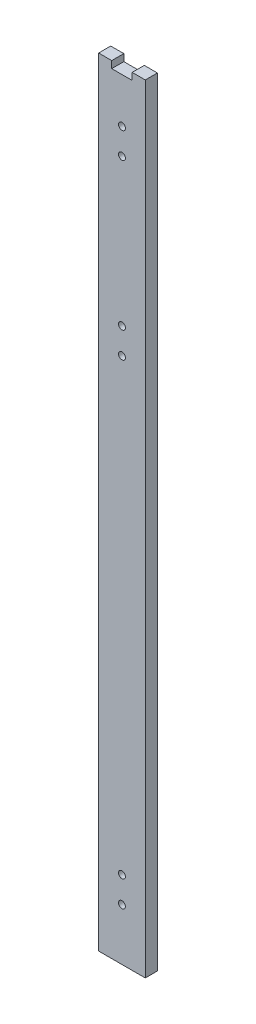
ISO-10303-21;
HEADER;
FILE_DESCRIPTION(('STEP AP214'),'2;1');
FILE_NAME('part.step','',(''),(''),'','','');
FILE_SCHEMA(('AUTOMOTIVE_DESIGN { 1 0 10303 214 1 1 1 1 }'));
ENDSEC;
DATA;
#1=APPLICATION_CONTEXT('core data for automotive mechanical design processes');
#2=APPLICATION_PROTOCOL_DEFINITION('international standard','automotive_design',2000,#1);
#3=PRODUCT_CONTEXT('',#1,'mechanical');
#4=PRODUCT('Part','Part','',(#3));
#5=PRODUCT_RELATED_PRODUCT_CATEGORY('part','',(#4));
#6=PRODUCT_DEFINITION_FORMATION('','',#4);
#7=PRODUCT_DEFINITION_CONTEXT('part definition',#1,'design');
#8=PRODUCT_DEFINITION('design','',#6,#7);
#9=PRODUCT_DEFINITION_SHAPE('','',#8);
#10=(LENGTH_UNIT() NAMED_UNIT(*) SI_UNIT(.MILLI.,.METRE.));
#11=(NAMED_UNIT(*) PLANE_ANGLE_UNIT() SI_UNIT($,.RADIAN.));
#12=(NAMED_UNIT(*) SI_UNIT($,.STERADIAN.) SOLID_ANGLE_UNIT());
#13=UNCERTAINTY_MEASURE_WITH_UNIT(LENGTH_MEASURE(1.E-05),#10,'distance_accuracy_value','');
#14=(GEOMETRIC_REPRESENTATION_CONTEXT(3) GLOBAL_UNCERTAINTY_ASSIGNED_CONTEXT((#13)) GLOBAL_UNIT_ASSIGNED_CONTEXT((#10,
#11,#12)) REPRESENTATION_CONTEXT('',''));
#15=CARTESIAN_POINT('',(0.,0.,0.));
#16=DIRECTION('',(0.,0.,1.));
#17=DIRECTION('',(1.,0.,0.));
#18=AXIS2_PLACEMENT_3D('',#15,#16,#17);
#19=CARTESIAN_POINT('',(0.,450.,0.));
#20=DIRECTION('',(0.,1.,0.));
#21=DIRECTION('',(0.,0.,1.));
#22=AXIS2_PLACEMENT_3D('',#19,#20,#21);
#23=PLANE('',#22);
#24=DIRECTION('',(0.,0.,1.));
#25=VECTOR('',#24,1.);
#26=CARTESIAN_POINT('',(-5.91396309482661,450.,0.));
#27=LINE('',#26,#25);
#28=CARTESIAN_POINT('',(-5.91396309482661,450.,-3.5));
#29=VERTEX_POINT('',#28);
#30=CARTESIAN_POINT('',(-5.91396309482661,450.,3.5));
#31=VERTEX_POINT('',#30);
#32=EDGE_CURVE('E11',#29,#31,#27,.T.);
#33=ORIENTED_EDGE('',*,*,#32,.F.);
#34=DIRECTION('',(-1.,0.,0.));
#35=VECTOR('',#34,1.);
#36=CARTESIAN_POINT('',(13.5,450.,-3.5));
#37=LINE('',#36,#35);
#38=CARTESIAN_POINT('',(-13.5,450.,-3.5));
#39=VERTEX_POINT('',#38);
#40=EDGE_CURVE('E57',#29,#39,#37,.T.);
#41=ORIENTED_EDGE('',*,*,#40,.T.);
#42=DIRECTION('',(0.,0.,1.));
#43=VECTOR('',#42,1.);
#44=CARTESIAN_POINT('',(-13.5,450.,3.5));
#45=LINE('',#44,#43);
#46=CARTESIAN_POINT('',(-13.5,450.,3.5));
#47=VERTEX_POINT('',#46);
#48=EDGE_CURVE('E139',#39,#47,#45,.T.);
#49=ORIENTED_EDGE('',*,*,#48,.T.);
#50=DIRECTION('',(1.,0.,0.));
#51=VECTOR('',#50,1.);
#52=CARTESIAN_POINT('',(13.5,450.,3.5));
#53=LINE('',#52,#51);
#54=EDGE_CURVE('E87',#47,#31,#53,.T.);
#55=ORIENTED_EDGE('',*,*,#54,.T.);
#56=EDGE_LOOP('',(#33,#41,#49,#55));
#57=FACE_BOUND('',#56,.T.);
#58=ADVANCED_FACE('F33',(#57),#23,.T.);
#59=CARTESIAN_POINT('',(-13.5,450.,3.5));
#60=DIRECTION('',(1.,0.,0.));
#61=DIRECTION('',(0.,0.,-1.));
#62=AXIS2_PLACEMENT_3D('',#59,#60,#61);
#63=PLANE('',#62);
#64=DIRECTION('',(0.,0.,1.));
#65=VECTOR('',#64,1.);
#66=CARTESIAN_POINT('',(-13.5,0.,3.5));
#67=LINE('',#66,#65);
#68=CARTESIAN_POINT('',(-13.5,0.,-3.5));
#69=VERTEX_POINT('',#68);
#70=CARTESIAN_POINT('',(-13.5,0.,3.5));
#71=VERTEX_POINT('',#70);
#72=EDGE_CURVE('E137',#69,#71,#67,.T.);
#73=ORIENTED_EDGE('',*,*,#72,.T.);
#74=DIRECTION('',(0.,-1.,0.));
#75=VECTOR('',#74,1.);
#76=CARTESIAN_POINT('',(-13.5,450.,3.5));
#77=LINE('',#76,#75);
#78=EDGE_CURVE('E161',#47,#71,#77,.T.);
#79=ORIENTED_EDGE('',*,*,#78,.F.);
#80=ORIENTED_EDGE('',*,*,#48,.F.);
#81=DIRECTION('',(0.,-1.,0.));
#82=VECTOR('',#81,1.);
#83=CARTESIAN_POINT('',(-13.5,450.,-3.5));
#84=LINE('',#83,#82);
#85=EDGE_CURVE('E147',#39,#69,#84,.T.);
#86=ORIENTED_EDGE('',*,*,#85,.T.);
#87=EDGE_LOOP('',(#73,#79,#80,#86));
#88=FACE_BOUND('',#87,.T.);
#89=ADVANCED_FACE('F35',(#88),#63,.F.);
#90=CARTESIAN_POINT('',(13.5,450.,3.5));
#91=DIRECTION('',(0.,0.,-1.));
#92=DIRECTION('',(-1.,0.,0.));
#93=AXIS2_PLACEMENT_3D('',#90,#91,#92);
#94=PLANE('',#93);
#95=CARTESIAN_POINT('',(0.,405.,3.50000000000001));
#96=DIRECTION('',(0.,0.,-1.));
#97=DIRECTION('',(-1.,0.,0.));
#98=AXIS2_PLACEMENT_3D('',#95,#96,#97);
#99=CIRCLE('',#98,2.);
#100=CARTESIAN_POINT('',(-2.00000000000001,405.,3.50000000000001));
#101=VERTEX_POINT('',#100);
#102=EDGE_CURVE('E211',#101,#101,#99,.T.);
#103=ORIENTED_EDGE('',*,*,#102,.T.);
#104=EDGE_LOOP('',(#103));
#105=FACE_BOUND('',#104,.T.);
#106=CARTESIAN_POINT('',(0.,320.,3.50000000000001));
#107=DIRECTION('',(0.,0.,-1.));
#108=DIRECTION('',(-1.,0.,0.));
#109=AXIS2_PLACEMENT_3D('',#106,#107,#108);
#110=CIRCLE('',#109,2.);
#111=CARTESIAN_POINT('',(-2.00000000000002,320.,3.50000000000001));
#112=VERTEX_POINT('',#111);
#113=EDGE_CURVE('E215',#112,#112,#110,.T.);
#114=ORIENTED_EDGE('',*,*,#113,.T.);
#115=EDGE_LOOP('',(#114));
#116=FACE_BOUND('',#115,.T.);
#117=CARTESIAN_POINT('',(0.,305.,3.50000000000001));
#118=DIRECTION('',(0.,0.,-1.));
#119=DIRECTION('',(-1.,0.,0.));
#120=AXIS2_PLACEMENT_3D('',#117,#118,#119);
#121=CIRCLE('',#120,1.99999999999999);
#122=CARTESIAN_POINT('',(-2.,305.,3.50000000000001));
#123=VERTEX_POINT('',#122);
#124=EDGE_CURVE('E219',#123,#123,#121,.T.);
#125=ORIENTED_EDGE('',*,*,#124,.T.);
#126=EDGE_LOOP('',(#125));
#127=FACE_BOUND('',#126,.T.);
#128=CARTESIAN_POINT('',(0.,30.,3.50000000000001));
#129=DIRECTION('',(0.,0.,-1.));
#130=DIRECTION('',(-1.,0.,0.));
#131=AXIS2_PLACEMENT_3D('',#128,#129,#130);
#132=CIRCLE('',#131,2.00000000000001);
#133=CARTESIAN_POINT('',(-2.00000000000006,30.,3.50000000000001));
#134=VERTEX_POINT('',#133);
#135=EDGE_CURVE('E223',#134,#134,#132,.T.);
#136=ORIENTED_EDGE('',*,*,#135,.T.);
#137=EDGE_LOOP('',(#136));
#138=FACE_BOUND('',#137,.T.);
#139=CARTESIAN_POINT('',(0.,45.,3.50000000000001));
#140=DIRECTION('',(0.,0.,-1.));
#141=DIRECTION('',(-1.,0.,0.));
#142=AXIS2_PLACEMENT_3D('',#139,#140,#141);
#143=CIRCLE('',#142,2.);
#144=CARTESIAN_POINT('',(-2.00000000000005,45.,3.50000000000001));
#145=VERTEX_POINT('',#144);
#146=EDGE_CURVE('E227',#145,#145,#143,.T.);
#147=ORIENTED_EDGE('',*,*,#146,.T.);
#148=EDGE_LOOP('',(#147));
#149=FACE_BOUND('',#148,.T.);
#150=CARTESIAN_POINT('',(0.,420.,3.50000000000001));
#151=DIRECTION('',(0.,0.,-1.));
#152=DIRECTION('',(-1.,0.,0.));
#153=AXIS2_PLACEMENT_3D('',#150,#151,#152);
#154=CIRCLE('',#153,2.);
#155=CARTESIAN_POINT('',(-2.,420.,3.50000000000001));
#156=VERTEX_POINT('',#155);
#157=EDGE_CURVE('E134',#156,#156,#154,.T.);
#158=ORIENTED_EDGE('',*,*,#157,.T.);
#159=EDGE_LOOP('',(#158));
#160=FACE_BOUND('',#159,.T.);
#161=DIRECTION('',(-1.,0.,0.));
#162=VECTOR('',#161,1.);
#163=CARTESIAN_POINT('',(5.91396309482661,445.958983682965,3.5));
#164=LINE('',#163,#162);
#165=CARTESIAN_POINT('',(5.91396309482661,445.958983682965,3.5));
#166=VERTEX_POINT('',#165);
#167=CARTESIAN_POINT('',(-5.91396309482661,445.958983682965,3.5));
#168=VERTEX_POINT('',#167);
#169=EDGE_CURVE('E116',#166,#168,#164,.T.);
#170=ORIENTED_EDGE('',*,*,#169,.T.);
#171=DIRECTION('',(0.,1.,0.));
#172=VECTOR('',#171,1.);
#173=CARTESIAN_POINT('',(-5.91396309482661,445.958983682965,3.5));
#174=LINE('',#173,#172);
#175=EDGE_CURVE('E126',#168,#31,#174,.T.);
#176=ORIENTED_EDGE('',*,*,#175,.T.);
#177=ORIENTED_EDGE('',*,*,#54,.F.);
#178=ORIENTED_EDGE('',*,*,#78,.T.);
#179=DIRECTION('',(1.,0.,0.));
#180=VECTOR('',#179,1.);
#181=CARTESIAN_POINT('',(13.5,0.,3.5));
#182=LINE('',#181,#180);
#183=CARTESIAN_POINT('',(13.5,0.,3.5));
#184=VERTEX_POINT('',#183);
#185=EDGE_CURVE('E150',#71,#184,#182,.T.);
#186=ORIENTED_EDGE('',*,*,#185,.T.);
#187=DIRECTION('',(0.,-1.,0.));
#188=VECTOR('',#187,1.);
#189=CARTESIAN_POINT('',(13.5,450.,3.5));
#190=LINE('',#189,#188);
#191=CARTESIAN_POINT('',(13.5,450.,3.5));
#192=VERTEX_POINT('',#191);
#193=EDGE_CURVE('E158',#192,#184,#190,.T.);
#194=ORIENTED_EDGE('',*,*,#193,.F.);
#195=CARTESIAN_POINT('',(5.91396309482661,450.,3.5));
#196=VERTEX_POINT('',#195);
#197=EDGE_CURVE('E125',#196,#192,#53,.T.);
#198=ORIENTED_EDGE('',*,*,#197,.F.);
#199=DIRECTION('',(0.,-1.,0.));
#200=VECTOR('',#199,1.);
#201=CARTESIAN_POINT('',(5.91396309482661,445.958983682965,3.5));
#202=LINE('',#201,#200);
#203=EDGE_CURVE('E48',#196,#166,#202,.T.);
#204=ORIENTED_EDGE('',*,*,#203,.T.);
#205=EDGE_LOOP('',(#170,#176,#177,#178,#186,#194,#198,#204));
#206=FACE_BOUND('',#205,.T.);
#207=ADVANCED_FACE('F123',(#105,#116,#127,#138,#149,#160,#206),#94,.F.);
#208=CARTESIAN_POINT('',(13.5,450.,3.5));
#209=DIRECTION('',(-1.,0.,0.));
#210=DIRECTION('',(0.,0.,1.));
#211=AXIS2_PLACEMENT_3D('',#208,#209,#210);
#212=PLANE('',#211);
#213=DIRECTION('',(0.,0.,-1.));
#214=VECTOR('',#213,1.);
#215=CARTESIAN_POINT('',(13.5,0.,3.5));
#216=LINE('',#215,#214);
#217=CARTESIAN_POINT('',(13.5,0.,-3.5));
#218=VERTEX_POINT('',#217);
#219=EDGE_CURVE('E152',#184,#218,#216,.T.);
#220=ORIENTED_EDGE('',*,*,#219,.T.);
#221=DIRECTION('',(0.,-1.,0.));
#222=VECTOR('',#221,1.);
#223=CARTESIAN_POINT('',(13.5,450.,-3.5));
#224=LINE('',#223,#222);
#225=CARTESIAN_POINT('',(13.5,450.,-3.5));
#226=VERTEX_POINT('',#225);
#227=EDGE_CURVE('E156',#226,#218,#224,.T.);
#228=ORIENTED_EDGE('',*,*,#227,.F.);
#229=DIRECTION('',(0.,0.,-1.));
#230=VECTOR('',#229,1.);
#231=CARTESIAN_POINT('',(13.5,450.,3.5));
#232=LINE('',#231,#230);
#233=EDGE_CURVE('E142',#192,#226,#232,.T.);
#234=ORIENTED_EDGE('',*,*,#233,.F.);
#235=ORIENTED_EDGE('',*,*,#193,.T.);
#236=EDGE_LOOP('',(#220,#228,#234,#235));
#237=FACE_BOUND('',#236,.T.);
#238=ADVANCED_FACE('F170',(#237),#212,.F.);
#239=CARTESIAN_POINT('',(13.5,450.,-3.5));
#240=DIRECTION('',(0.,0.,1.));
#241=DIRECTION('',(1.,0.,0.));
#242=AXIS2_PLACEMENT_3D('',#239,#240,#241);
#243=PLANE('',#242);
#244=CARTESIAN_POINT('',(0.,405.,-3.5));
#245=DIRECTION('',(0.,0.,-1.));
#246=DIRECTION('',(-1.,0.,0.));
#247=AXIS2_PLACEMENT_3D('',#244,#245,#246);
#248=CIRCLE('',#247,2.);
#249=CARTESIAN_POINT('',(-2.00000000000001,405.,-3.5));
#250=VERTEX_POINT('',#249);
#251=EDGE_CURVE('E251',#250,#250,#248,.T.);
#252=ORIENTED_EDGE('',*,*,#251,.F.);
#253=EDGE_LOOP('',(#252));
#254=FACE_BOUND('',#253,.T.);
#255=CARTESIAN_POINT('',(0.,320.,-3.5));
#256=DIRECTION('',(0.,0.,-1.));
#257=DIRECTION('',(-1.,0.,0.));
#258=AXIS2_PLACEMENT_3D('',#255,#256,#257);
#259=CIRCLE('',#258,2.);
#260=CARTESIAN_POINT('',(-2.00000000000002,320.,-3.5));
#261=VERTEX_POINT('',#260);
#262=EDGE_CURVE('E247',#261,#261,#259,.T.);
#263=ORIENTED_EDGE('',*,*,#262,.F.);
#264=EDGE_LOOP('',(#263));
#265=FACE_BOUND('',#264,.T.);
#266=CARTESIAN_POINT('',(0.,305.,-3.5));
#267=DIRECTION('',(0.,0.,-1.));
#268=DIRECTION('',(-1.,0.,0.));
#269=AXIS2_PLACEMENT_3D('',#266,#267,#268);
#270=CIRCLE('',#269,1.99999999999999);
#271=CARTESIAN_POINT('',(-2.00000000000001,305.,-3.5));
#272=VERTEX_POINT('',#271);
#273=EDGE_CURVE('E243',#272,#272,#270,.T.);
#274=ORIENTED_EDGE('',*,*,#273,.F.);
#275=EDGE_LOOP('',(#274));
#276=FACE_BOUND('',#275,.T.);
#277=CARTESIAN_POINT('',(0.,30.,-3.5));
#278=DIRECTION('',(0.,0.,-1.));
#279=DIRECTION('',(-1.,0.,0.));
#280=AXIS2_PLACEMENT_3D('',#277,#278,#279);
#281=CIRCLE('',#280,2.00000000000001);
#282=CARTESIAN_POINT('',(-2.00000000000006,30.,-3.5));
#283=VERTEX_POINT('',#282);
#284=EDGE_CURVE('E239',#283,#283,#281,.T.);
#285=ORIENTED_EDGE('',*,*,#284,.F.);
#286=EDGE_LOOP('',(#285));
#287=FACE_BOUND('',#286,.T.);
#288=CARTESIAN_POINT('',(0.,45.,-3.5));
#289=DIRECTION('',(0.,0.,-1.));
#290=DIRECTION('',(-1.,0.,0.));
#291=AXIS2_PLACEMENT_3D('',#288,#289,#290);
#292=CIRCLE('',#291,2.);
#293=CARTESIAN_POINT('',(-2.00000000000005,45.,-3.5));
#294=VERTEX_POINT('',#293);
#295=EDGE_CURVE('E235',#294,#294,#292,.T.);
#296=ORIENTED_EDGE('',*,*,#295,.F.);
#297=EDGE_LOOP('',(#296));
#298=FACE_BOUND('',#297,.T.);
#299=CARTESIAN_POINT('',(0.,420.,-3.5));
#300=DIRECTION('',(0.,0.,-1.));
#301=DIRECTION('',(-1.,0.,0.));
#302=AXIS2_PLACEMENT_3D('',#299,#300,#301);
#303=CIRCLE('',#302,2.);
#304=CARTESIAN_POINT('',(-2.,420.,-3.5));
#305=VERTEX_POINT('',#304);
#306=EDGE_CURVE('E231',#305,#305,#303,.T.);
#307=ORIENTED_EDGE('',*,*,#306,.F.);
#308=EDGE_LOOP('',(#307));
#309=FACE_BOUND('',#308,.T.);
#310=ORIENTED_EDGE('',*,*,#40,.F.);
#311=DIRECTION('',(0.,1.,0.));
#312=VECTOR('',#311,1.);
#313=CARTESIAN_POINT('',(-5.91396309482661,445.958983682965,-3.5));
#314=LINE('',#313,#312);
#315=CARTESIAN_POINT('',(-5.91396309482661,445.958983682965,-3.5));
#316=VERTEX_POINT('',#315);
#317=EDGE_CURVE('E132',#316,#29,#314,.T.);
#318=ORIENTED_EDGE('',*,*,#317,.F.);
#319=DIRECTION('',(-1.,0.,0.));
#320=VECTOR('',#319,1.);
#321=CARTESIAN_POINT('',(5.91396309482661,445.958983682965,-3.5));
#322=LINE('',#321,#320);
#323=CARTESIAN_POINT('',(5.91396309482661,445.958983682965,-3.5));
#324=VERTEX_POINT('',#323);
#325=EDGE_CURVE('E128',#324,#316,#322,.T.);
#326=ORIENTED_EDGE('',*,*,#325,.F.);
#327=DIRECTION('',(0.,-1.,0.));
#328=VECTOR('',#327,1.);
#329=CARTESIAN_POINT('',(5.91396309482661,445.958983682965,-3.5));
#330=LINE('',#329,#328);
#331=CARTESIAN_POINT('',(5.91396309482661,450.,-3.5));
#332=VERTEX_POINT('',#331);
#333=EDGE_CURVE('E111',#332,#324,#330,.T.);
#334=ORIENTED_EDGE('',*,*,#333,.F.);
#335=EDGE_CURVE('E144',#226,#332,#37,.T.);
#336=ORIENTED_EDGE('',*,*,#335,.F.);
#337=ORIENTED_EDGE('',*,*,#227,.T.);
#338=DIRECTION('',(-1.,0.,0.));
#339=VECTOR('',#338,1.);
#340=CARTESIAN_POINT('',(13.5,0.,-3.5));
#341=LINE('',#340,#339);
#342=EDGE_CURVE('E79',#218,#69,#341,.T.);
#343=ORIENTED_EDGE('',*,*,#342,.T.);
#344=ORIENTED_EDGE('',*,*,#85,.F.);
#345=EDGE_LOOP('',(#310,#318,#326,#334,#336,#337,#343,#344));
#346=FACE_BOUND('',#345,.T.);
#347=ADVANCED_FACE('F164',(#254,#265,#276,#287,#298,#309,#346),#243,.F.);
#348=DIRECTION('',(0.,0.,-1.));
#349=VECTOR('',#348,1.);
#350=CARTESIAN_POINT('',(5.91396309482661,450.,0.));
#351=LINE('',#350,#349);
#352=EDGE_CURVE('E41',#196,#332,#351,.T.);
#353=ORIENTED_EDGE('',*,*,#352,.F.);
#354=ORIENTED_EDGE('',*,*,#197,.T.);
#355=ORIENTED_EDGE('',*,*,#233,.T.);
#356=ORIENTED_EDGE('',*,*,#335,.T.);
#357=EDGE_LOOP('',(#353,#354,#355,#356));
#358=FACE_BOUND('',#357,.T.);
#359=ADVANCED_FACE('F166',(#358),#23,.T.);
#360=CARTESIAN_POINT('',(0.,0.,0.));
#361=DIRECTION('',(0.,1.,0.));
#362=DIRECTION('',(0.,0.,1.));
#363=AXIS2_PLACEMENT_3D('',#360,#361,#362);
#364=PLANE('',#363);
#365=ORIENTED_EDGE('',*,*,#72,.F.);
#366=ORIENTED_EDGE('',*,*,#342,.F.);
#367=ORIENTED_EDGE('',*,*,#219,.F.);
#368=ORIENTED_EDGE('',*,*,#185,.F.);
#369=EDGE_LOOP('',(#365,#366,#367,#368));
#370=FACE_BOUND('',#369,.T.);
#371=ADVANCED_FACE('F174',(#370),#364,.F.);
#372=CARTESIAN_POINT('',(-5.91396309482661,445.958983682965,3.5));
#373=DIRECTION('',(-1.,0.,0.));
#374=DIRECTION('',(0.,0.,1.));
#375=AXIS2_PLACEMENT_3D('',#372,#373,#374);
#376=PLANE('',#375);
#377=ORIENTED_EDGE('',*,*,#32,.T.);
#378=ORIENTED_EDGE('',*,*,#175,.F.);
#379=DIRECTION('',(0.,0.,-1.));
#380=VECTOR('',#379,1.);
#381=CARTESIAN_POINT('',(-5.91396309482661,445.958983682965,3.5));
#382=LINE('',#381,#380);
#383=EDGE_CURVE('E115',#168,#316,#382,.T.);
#384=ORIENTED_EDGE('',*,*,#383,.T.);
#385=ORIENTED_EDGE('',*,*,#317,.T.);
#386=EDGE_LOOP('',(#377,#378,#384,#385));
#387=FACE_BOUND('',#386,.T.);
#388=ADVANCED_FACE('F179',(#387),#376,.F.);
#389=CARTESIAN_POINT('',(5.91396309482661,445.958983682965,3.5));
#390=DIRECTION('',(0.,-1.,0.));
#391=DIRECTION('',(0.,0.,-1.));
#392=AXIS2_PLACEMENT_3D('',#389,#390,#391);
#393=PLANE('',#392);
#394=ORIENTED_EDGE('',*,*,#325,.T.);
#395=ORIENTED_EDGE('',*,*,#383,.F.);
#396=ORIENTED_EDGE('',*,*,#169,.F.);
#397=DIRECTION('',(0.,0.,-1.));
#398=VECTOR('',#397,1.);
#399=CARTESIAN_POINT('',(5.91396309482661,445.958983682965,3.5));
#400=LINE('',#399,#398);
#401=EDGE_CURVE('E107',#166,#324,#400,.T.);
#402=ORIENTED_EDGE('',*,*,#401,.T.);
#403=EDGE_LOOP('',(#394,#395,#396,#402));
#404=FACE_BOUND('',#403,.T.);
#405=ADVANCED_FACE('F119',(#404),#393,.F.);
#406=CARTESIAN_POINT('',(5.91396309482661,445.958983682965,3.5));
#407=DIRECTION('',(1.,0.,0.));
#408=DIRECTION('',(0.,0.,-1.));
#409=AXIS2_PLACEMENT_3D('',#406,#407,#408);
#410=PLANE('',#409);
#411=ORIENTED_EDGE('',*,*,#352,.T.);
#412=ORIENTED_EDGE('',*,*,#333,.T.);
#413=ORIENTED_EDGE('',*,*,#401,.F.);
#414=ORIENTED_EDGE('',*,*,#203,.F.);
#415=EDGE_LOOP('',(#411,#412,#413,#414));
#416=FACE_BOUND('',#415,.T.);
#417=ADVANCED_FACE('F109',(#416),#410,.F.);
#418=CARTESIAN_POINT('',(0.,420.,3.50000000000001));
#419=DIRECTION('',(0.,0.,-1.));
#420=DIRECTION('',(-1.,0.,0.));
#421=AXIS2_PLACEMENT_3D('',#418,#419,#420);
#422=CYLINDRICAL_SURFACE('',#421,2.);
#423=CARTESIAN_POINT('',(-2.,420.,3.50000000000001));
#424=CARTESIAN_POINT('',(-2.,420.,3.42708333333334));
#425=CARTESIAN_POINT('',(-2.,420.,3.35416666666667));
#426=CARTESIAN_POINT('',(-2.,420.,3.20833333333334));
#427=CARTESIAN_POINT('',(-2.,420.,3.13541666666667));
#428=CARTESIAN_POINT('',(-2.,420.,2.98958333333334));
#429=CARTESIAN_POINT('',(-2.,420.,2.91666666666667));
#430=CARTESIAN_POINT('',(-2.,420.,2.77083333333334));
#431=CARTESIAN_POINT('',(-2.,420.,2.69791666666667));
#432=CARTESIAN_POINT('',(-2.,420.,2.55208333333334));
#433=CARTESIAN_POINT('',(-2.,420.,2.47916666666667));
#434=CARTESIAN_POINT('',(-2.,420.,2.33333333333334));
#435=CARTESIAN_POINT('',(-2.,420.,2.26041666666667));
#436=CARTESIAN_POINT('',(-2.,420.,2.11458333333334));
#437=CARTESIAN_POINT('',(-2.,420.,2.04166666666667));
#438=CARTESIAN_POINT('',(-2.,420.,1.89583333333334));
#439=CARTESIAN_POINT('',(-2.,420.,1.82291666666667));
#440=CARTESIAN_POINT('',(-2.,420.,1.67708333333334));
#441=CARTESIAN_POINT('',(-2.,420.,1.60416666666667));
#442=CARTESIAN_POINT('',(-2.,420.,1.45833333333334));
#443=CARTESIAN_POINT('',(-2.,420.,1.38541666666667));
#444=CARTESIAN_POINT('',(-2.,420.,1.23958333333334));
#445=CARTESIAN_POINT('',(-2.,420.,1.16666666666667));
#446=CARTESIAN_POINT('',(-2.,420.,1.02083333333334));
#447=CARTESIAN_POINT('',(-2.,420.,0.94791666666667));
#448=CARTESIAN_POINT('',(-2.,420.,0.802083333333337));
#449=CARTESIAN_POINT('',(-2.,420.,0.72916666666667));
#450=CARTESIAN_POINT('',(-2.,420.,0.583333333333336));
#451=CARTESIAN_POINT('',(-2.,420.,0.51041666666667));
#452=CARTESIAN_POINT('',(-2.,420.,0.364583333333336));
#453=CARTESIAN_POINT('',(-2.,420.,0.29166666666667));
#454=CARTESIAN_POINT('',(-2.,420.,0.145833333333336));
#455=CARTESIAN_POINT('',(-2.,420.,0.0729166666666693));
#456=CARTESIAN_POINT('',(-2.,420.,-0.0729166666666641));
#457=CARTESIAN_POINT('',(-2.,420.,-0.145833333333331));
#458=CARTESIAN_POINT('',(-2.,420.,-0.291666666666664));
#459=CARTESIAN_POINT('',(-2.,420.,-0.36458333333333));
#460=CARTESIAN_POINT('',(-2.,420.,-0.510416666666664));
#461=CARTESIAN_POINT('',(-2.,420.,-0.58333333333333));
#462=CARTESIAN_POINT('',(-2.,420.,-0.729166666666664));
#463=CARTESIAN_POINT('',(-2.,420.,-0.802083333333331));
#464=CARTESIAN_POINT('',(-2.,420.,-0.947916666666664));
#465=CARTESIAN_POINT('',(-2.,420.,-1.02083333333333));
#466=CARTESIAN_POINT('',(-2.,420.,-1.16666666666666));
#467=CARTESIAN_POINT('',(-2.,420.,-1.23958333333333));
#468=CARTESIAN_POINT('',(-2.,420.,-1.38541666666666));
#469=CARTESIAN_POINT('',(-2.,420.,-1.45833333333333));
#470=CARTESIAN_POINT('',(-2.,420.,-1.60416666666666));
#471=CARTESIAN_POINT('',(-2.,420.,-1.67708333333333));
#472=CARTESIAN_POINT('',(-2.,420.,-1.82291666666667));
#473=CARTESIAN_POINT('',(-2.,420.,-1.89583333333333));
#474=CARTESIAN_POINT('',(-2.,420.,-2.04166666666667));
#475=CARTESIAN_POINT('',(-2.,420.,-2.11458333333333));
#476=CARTESIAN_POINT('',(-2.,420.,-2.26041666666667));
#477=CARTESIAN_POINT('',(-2.,420.,-2.33333333333333));
#478=CARTESIAN_POINT('',(-2.,420.,-2.47916666666667));
#479=CARTESIAN_POINT('',(-2.,420.,-2.55208333333333));
#480=CARTESIAN_POINT('',(-2.,420.,-2.69791666666667));
#481=CARTESIAN_POINT('',(-2.,420.,-2.77083333333333));
#482=CARTESIAN_POINT('',(-2.,420.,-2.91666666666667));
#483=CARTESIAN_POINT('',(-2.,420.,-2.98958333333333));
#484=CARTESIAN_POINT('',(-2.,420.,-3.13541666666667));
#485=CARTESIAN_POINT('',(-2.,420.,-3.20833333333333));
#486=CARTESIAN_POINT('',(-2.,420.,-3.35416666666667));
#487=CARTESIAN_POINT('',(-2.,420.,-3.42708333333333));
#488=CARTESIAN_POINT('',(-2.,420.,-3.5));
#489=B_SPLINE_CURVE_WITH_KNOTS('',3,(#423,#424,#425,#426,#427,#428,#429,#430,#431,#432,#433,
#434,#435,#436,#437,#438,#439,#440,#441,#442,#443,#444,#445,#446,#447,#448,#449,#450,#451,#452,
#453,#454,#455,#456,#457,#458,#459,#460,#461,#462,#463,#464,#465,#466,#467,#468,#469,#470,#471,
#472,#473,#474,#475,#476,#477,#478,#479,#480,#481,#482,#483,#484,#485,#486,#487,#488),
.UNSPECIFIED.,.F.,.F.,(4,2,2,2,2,2,2,2,2,2,2,2,2,2,2,2,2,2,2,2,2,2,2,2,2,2,2,2,2,2,2,2,4),(0.,
0.21875,0.4375,0.656250000000001,0.875000000000001,1.09375,1.3125,1.53125,1.75,1.96875,2.1875,
2.40625,2.625,2.84375,3.0625,3.28125,3.5,3.71875,3.9375,4.15625,4.375,4.59375,4.8125,5.03125,
5.25000000000001,5.46875000000001,5.68750000000001,5.90625000000001,6.12500000000001,
6.34375000000001,6.56250000000001,6.78125000000001,7.00000000000001),.UNSPECIFIED.);
#490=EDGE_CURVE('BSEAM277',#156,#305,#489,.T.);
#491=ORIENTED_EDGE('',*,*,#157,.F.);
#492=ORIENTED_EDGE('',*,*,#306,.T.);
#493=ORIENTED_EDGE('',*,*,#490,.T.);
#494=ORIENTED_EDGE('',*,*,#490,.F.);
#495=EDGE_LOOP('',(#491,#493,#492,#494));
#496=FACE_BOUND('',#495,.T.);
#497=ADVANCED_FACE('F277',(#496),#422,.F.);
#498=CARTESIAN_POINT('',(0.,45.,3.50000000000001));
#499=DIRECTION('',(0.,0.,-1.));
#500=DIRECTION('',(-1.,0.,0.));
#501=AXIS2_PLACEMENT_3D('',#498,#499,#500);
#502=CYLINDRICAL_SURFACE('',#501,2.);
#503=CARTESIAN_POINT('',(-2.00000000000005,45.,3.50000000000001));
#504=CARTESIAN_POINT('',(-2.00000000000005,45.,3.42708333333334));
#505=CARTESIAN_POINT('',(-2.00000000000005,45.,3.35416666666667));
#506=CARTESIAN_POINT('',(-2.00000000000005,45.,3.20833333333334));
#507=CARTESIAN_POINT('',(-2.00000000000005,45.,3.13541666666667));
#508=CARTESIAN_POINT('',(-2.00000000000005,45.,2.98958333333334));
#509=CARTESIAN_POINT('',(-2.00000000000005,45.,2.91666666666667));
#510=CARTESIAN_POINT('',(-2.00000000000005,45.,2.77083333333334));
#511=CARTESIAN_POINT('',(-2.00000000000005,45.,2.69791666666667));
#512=CARTESIAN_POINT('',(-2.00000000000005,45.,2.55208333333334));
#513=CARTESIAN_POINT('',(-2.00000000000005,45.,2.47916666666667));
#514=CARTESIAN_POINT('',(-2.00000000000005,45.,2.33333333333334));
#515=CARTESIAN_POINT('',(-2.00000000000005,45.,2.26041666666667));
#516=CARTESIAN_POINT('',(-2.00000000000005,45.,2.11458333333334));
#517=CARTESIAN_POINT('',(-2.00000000000005,45.,2.04166666666667));
#518=CARTESIAN_POINT('',(-2.00000000000005,45.,1.89583333333334));
#519=CARTESIAN_POINT('',(-2.00000000000005,45.,1.82291666666667));
#520=CARTESIAN_POINT('',(-2.00000000000005,45.,1.67708333333334));
#521=CARTESIAN_POINT('',(-2.00000000000005,45.,1.60416666666667));
#522=CARTESIAN_POINT('',(-2.00000000000005,45.,1.45833333333334));
#523=CARTESIAN_POINT('',(-2.00000000000005,45.,1.38541666666667));
#524=CARTESIAN_POINT('',(-2.00000000000005,45.,1.23958333333334));
#525=CARTESIAN_POINT('',(-2.00000000000005,45.,1.16666666666667));
#526=CARTESIAN_POINT('',(-2.00000000000005,45.,1.02083333333334));
#527=CARTESIAN_POINT('',(-2.00000000000005,45.,0.94791666666667));
#528=CARTESIAN_POINT('',(-2.00000000000005,45.,0.802083333333337));
#529=CARTESIAN_POINT('',(-2.00000000000005,45.,0.72916666666667));
#530=CARTESIAN_POINT('',(-2.00000000000005,45.,0.583333333333336));
#531=CARTESIAN_POINT('',(-2.00000000000005,45.,0.51041666666667));
#532=CARTESIAN_POINT('',(-2.00000000000005,45.,0.364583333333336));
#533=CARTESIAN_POINT('',(-2.00000000000005,45.,0.29166666666667));
#534=CARTESIAN_POINT('',(-2.00000000000005,45.,0.145833333333336));
#535=CARTESIAN_POINT('',(-2.00000000000005,45.,0.0729166666666693));
#536=CARTESIAN_POINT('',(-2.00000000000005,45.,-0.0729166666666641));
#537=CARTESIAN_POINT('',(-2.00000000000005,45.,-0.145833333333331));
#538=CARTESIAN_POINT('',(-2.00000000000005,45.,-0.291666666666664));
#539=CARTESIAN_POINT('',(-2.00000000000005,45.,-0.36458333333333));
#540=CARTESIAN_POINT('',(-2.00000000000005,45.,-0.510416666666664));
#541=CARTESIAN_POINT('',(-2.00000000000005,45.,-0.58333333333333));
#542=CARTESIAN_POINT('',(-2.00000000000005,45.,-0.729166666666664));
#543=CARTESIAN_POINT('',(-2.00000000000005,45.,-0.802083333333331));
#544=CARTESIAN_POINT('',(-2.00000000000005,45.,-0.947916666666664));
#545=CARTESIAN_POINT('',(-2.00000000000005,45.,-1.02083333333333));
#546=CARTESIAN_POINT('',(-2.00000000000005,45.,-1.16666666666666));
#547=CARTESIAN_POINT('',(-2.00000000000005,45.,-1.23958333333333));
#548=CARTESIAN_POINT('',(-2.00000000000005,45.,-1.38541666666666));
#549=CARTESIAN_POINT('',(-2.00000000000005,45.,-1.45833333333333));
#550=CARTESIAN_POINT('',(-2.00000000000005,45.,-1.60416666666666));
#551=CARTESIAN_POINT('',(-2.00000000000005,45.,-1.67708333333333));
#552=CARTESIAN_POINT('',(-2.00000000000005,45.,-1.82291666666667));
#553=CARTESIAN_POINT('',(-2.00000000000005,45.,-1.89583333333333));
#554=CARTESIAN_POINT('',(-2.00000000000005,45.,-2.04166666666667));
#555=CARTESIAN_POINT('',(-2.00000000000005,45.,-2.11458333333333));
#556=CARTESIAN_POINT('',(-2.00000000000005,45.,-2.26041666666667));
#557=CARTESIAN_POINT('',(-2.00000000000005,45.,-2.33333333333333));
#558=CARTESIAN_POINT('',(-2.00000000000005,45.,-2.47916666666667));
#559=CARTESIAN_POINT('',(-2.00000000000005,45.,-2.55208333333333));
#560=CARTESIAN_POINT('',(-2.00000000000005,45.,-2.69791666666667));
#561=CARTESIAN_POINT('',(-2.00000000000005,45.,-2.77083333333333));
#562=CARTESIAN_POINT('',(-2.00000000000005,45.,-2.91666666666667));
#563=CARTESIAN_POINT('',(-2.00000000000005,45.,-2.98958333333333));
#564=CARTESIAN_POINT('',(-2.00000000000005,45.,-3.13541666666667));
#565=CARTESIAN_POINT('',(-2.00000000000005,45.,-3.20833333333333));
#566=CARTESIAN_POINT('',(-2.00000000000005,45.,-3.35416666666667));
#567=CARTESIAN_POINT('',(-2.00000000000005,45.,-3.42708333333333));
#568=CARTESIAN_POINT('',(-2.00000000000005,45.,-3.5));
#569=B_SPLINE_CURVE_WITH_KNOTS('',3,(#503,#504,#505,#506,#507,#508,#509,#510,#511,#512,#513,
#514,#515,#516,#517,#518,#519,#520,#521,#522,#523,#524,#525,#526,#527,#528,#529,#530,#531,#532,
#533,#534,#535,#536,#537,#538,#539,#540,#541,#542,#543,#544,#545,#546,#547,#548,#549,#550,#551,
#552,#553,#554,#555,#556,#557,#558,#559,#560,#561,#562,#563,#564,#565,#566,#567,#568),
.UNSPECIFIED.,.F.,.F.,(4,2,2,2,2,2,2,2,2,2,2,2,2,2,2,2,2,2,2,2,2,2,2,2,2,2,2,2,2,2,2,2,4),(0.,
0.21875,0.4375,0.656250000000001,0.875000000000001,1.09375,1.3125,1.53125,1.75,1.96875,2.1875,
2.40625,2.625,2.84375,3.0625,3.28125,3.5,3.71875,3.9375,4.15625,4.375,4.59375,4.8125,5.03125,
5.25000000000001,5.46875000000001,5.68750000000001,5.90625000000001,6.12500000000001,
6.34375000000001,6.56250000000001,6.78125000000001,7.00000000000001),.UNSPECIFIED.);
#570=EDGE_CURVE('BSEAM273',#145,#294,#569,.T.);
#571=ORIENTED_EDGE('',*,*,#146,.F.);
#572=ORIENTED_EDGE('',*,*,#295,.T.);
#573=ORIENTED_EDGE('',*,*,#570,.T.);
#574=ORIENTED_EDGE('',*,*,#570,.F.);
#575=EDGE_LOOP('',(#571,#573,#572,#574));
#576=FACE_BOUND('',#575,.T.);
#577=ADVANCED_FACE('F273',(#576),#502,.F.);
#578=CARTESIAN_POINT('',(0.,30.,3.50000000000001));
#579=DIRECTION('',(0.,0.,-1.));
#580=DIRECTION('',(-1.,0.,0.));
#581=AXIS2_PLACEMENT_3D('',#578,#579,#580);
#582=CYLINDRICAL_SURFACE('',#581,2.00000000000001);
#583=CARTESIAN_POINT('',(-2.00000000000006,30.,3.50000000000001));
#584=CARTESIAN_POINT('',(-2.00000000000006,30.,3.42708333333334));
#585=CARTESIAN_POINT('',(-2.00000000000006,30.,3.35416666666667));
#586=CARTESIAN_POINT('',(-2.00000000000006,30.,3.20833333333334));
#587=CARTESIAN_POINT('',(-2.00000000000006,30.,3.13541666666667));
#588=CARTESIAN_POINT('',(-2.00000000000006,30.,2.98958333333334));
#589=CARTESIAN_POINT('',(-2.00000000000006,30.,2.91666666666667));
#590=CARTESIAN_POINT('',(-2.00000000000006,30.,2.77083333333334));
#591=CARTESIAN_POINT('',(-2.00000000000006,30.,2.69791666666667));
#592=CARTESIAN_POINT('',(-2.00000000000006,30.,2.55208333333334));
#593=CARTESIAN_POINT('',(-2.00000000000006,30.,2.47916666666667));
#594=CARTESIAN_POINT('',(-2.00000000000006,30.,2.33333333333334));
#595=CARTESIAN_POINT('',(-2.00000000000006,30.,2.26041666666667));
#596=CARTESIAN_POINT('',(-2.00000000000006,30.,2.11458333333334));
#597=CARTESIAN_POINT('',(-2.00000000000006,30.,2.04166666666667));
#598=CARTESIAN_POINT('',(-2.00000000000006,30.,1.89583333333334));
#599=CARTESIAN_POINT('',(-2.00000000000006,30.,1.82291666666667));
#600=CARTESIAN_POINT('',(-2.00000000000006,30.,1.67708333333334));
#601=CARTESIAN_POINT('',(-2.00000000000006,30.,1.60416666666667));
#602=CARTESIAN_POINT('',(-2.00000000000006,30.,1.45833333333334));
#603=CARTESIAN_POINT('',(-2.00000000000006,30.,1.38541666666667));
#604=CARTESIAN_POINT('',(-2.00000000000006,30.,1.23958333333334));
#605=CARTESIAN_POINT('',(-2.00000000000006,30.,1.16666666666667));
#606=CARTESIAN_POINT('',(-2.00000000000006,30.,1.02083333333334));
#607=CARTESIAN_POINT('',(-2.00000000000006,30.,0.94791666666667));
#608=CARTESIAN_POINT('',(-2.00000000000006,30.,0.802083333333337));
#609=CARTESIAN_POINT('',(-2.00000000000006,30.,0.72916666666667));
#610=CARTESIAN_POINT('',(-2.00000000000006,30.,0.583333333333336));
#611=CARTESIAN_POINT('',(-2.00000000000006,30.,0.51041666666667));
#612=CARTESIAN_POINT('',(-2.00000000000006,30.,0.364583333333336));
#613=CARTESIAN_POINT('',(-2.00000000000006,30.,0.29166666666667));
#614=CARTESIAN_POINT('',(-2.00000000000006,30.,0.145833333333336));
#615=CARTESIAN_POINT('',(-2.00000000000006,30.,0.0729166666666693));
#616=CARTESIAN_POINT('',(-2.00000000000006,30.,-0.0729166666666641));
#617=CARTESIAN_POINT('',(-2.00000000000006,30.,-0.145833333333331));
#618=CARTESIAN_POINT('',(-2.00000000000006,30.,-0.291666666666664));
#619=CARTESIAN_POINT('',(-2.00000000000006,30.,-0.36458333333333));
#620=CARTESIAN_POINT('',(-2.00000000000006,30.,-0.510416666666664));
#621=CARTESIAN_POINT('',(-2.00000000000006,30.,-0.58333333333333));
#622=CARTESIAN_POINT('',(-2.00000000000006,30.,-0.729166666666664));
#623=CARTESIAN_POINT('',(-2.00000000000006,30.,-0.802083333333331));
#624=CARTESIAN_POINT('',(-2.00000000000006,30.,-0.947916666666664));
#625=CARTESIAN_POINT('',(-2.00000000000006,30.,-1.02083333333333));
#626=CARTESIAN_POINT('',(-2.00000000000006,30.,-1.16666666666666));
#627=CARTESIAN_POINT('',(-2.00000000000006,30.,-1.23958333333333));
#628=CARTESIAN_POINT('',(-2.00000000000006,30.,-1.38541666666666));
#629=CARTESIAN_POINT('',(-2.00000000000006,30.,-1.45833333333333));
#630=CARTESIAN_POINT('',(-2.00000000000006,30.,-1.60416666666666));
#631=CARTESIAN_POINT('',(-2.00000000000006,30.,-1.67708333333333));
#632=CARTESIAN_POINT('',(-2.00000000000006,30.,-1.82291666666667));
#633=CARTESIAN_POINT('',(-2.00000000000006,30.,-1.89583333333333));
#634=CARTESIAN_POINT('',(-2.00000000000006,30.,-2.04166666666667));
#635=CARTESIAN_POINT('',(-2.00000000000006,30.,-2.11458333333333));
#636=CARTESIAN_POINT('',(-2.00000000000006,30.,-2.26041666666667));
#637=CARTESIAN_POINT('',(-2.00000000000006,30.,-2.33333333333333));
#638=CARTESIAN_POINT('',(-2.00000000000006,30.,-2.47916666666667));
#639=CARTESIAN_POINT('',(-2.00000000000006,30.,-2.55208333333333));
#640=CARTESIAN_POINT('',(-2.00000000000006,30.,-2.69791666666667));
#641=CARTESIAN_POINT('',(-2.00000000000006,30.,-2.77083333333333));
#642=CARTESIAN_POINT('',(-2.00000000000006,30.,-2.91666666666667));
#643=CARTESIAN_POINT('',(-2.00000000000006,30.,-2.98958333333333));
#644=CARTESIAN_POINT('',(-2.00000000000006,30.,-3.13541666666667));
#645=CARTESIAN_POINT('',(-2.00000000000006,30.,-3.20833333333333));
#646=CARTESIAN_POINT('',(-2.00000000000006,30.,-3.35416666666667));
#647=CARTESIAN_POINT('',(-2.00000000000006,30.,-3.42708333333333));
#648=CARTESIAN_POINT('',(-2.00000000000006,30.,-3.5));
#649=B_SPLINE_CURVE_WITH_KNOTS('',3,(#583,#584,#585,#586,#587,#588,#589,#590,#591,#592,#593,
#594,#595,#596,#597,#598,#599,#600,#601,#602,#603,#604,#605,#606,#607,#608,#609,#610,#611,#612,
#613,#614,#615,#616,#617,#618,#619,#620,#621,#622,#623,#624,#625,#626,#627,#628,#629,#630,#631,
#632,#633,#634,#635,#636,#637,#638,#639,#640,#641,#642,#643,#644,#645,#646,#647,#648),
.UNSPECIFIED.,.F.,.F.,(4,2,2,2,2,2,2,2,2,2,2,2,2,2,2,2,2,2,2,2,2,2,2,2,2,2,2,2,2,2,2,2,4),(0.,
0.21875,0.4375,0.656250000000001,0.875000000000001,1.09375,1.3125,1.53125,1.75,1.96875,2.1875,
2.40625,2.625,2.84375,3.0625,3.28125,3.5,3.71875,3.9375,4.15625,4.375,4.59375,4.8125,5.03125,
5.25000000000001,5.46875000000001,5.68750000000001,5.90625000000001,6.12500000000001,
6.34375000000001,6.56250000000001,6.78125000000001,7.00000000000001),.UNSPECIFIED.);
#650=EDGE_CURVE('BSEAM269',#134,#283,#649,.T.);
#651=ORIENTED_EDGE('',*,*,#135,.F.);
#652=ORIENTED_EDGE('',*,*,#284,.T.);
#653=ORIENTED_EDGE('',*,*,#650,.T.);
#654=ORIENTED_EDGE('',*,*,#650,.F.);
#655=EDGE_LOOP('',(#651,#653,#652,#654));
#656=FACE_BOUND('',#655,.T.);
#657=ADVANCED_FACE('F269',(#656),#582,.F.);
#658=CARTESIAN_POINT('',(0.,305.,3.50000000000001));
#659=DIRECTION('',(0.,0.,-1.));
#660=DIRECTION('',(-1.,0.,0.));
#661=AXIS2_PLACEMENT_3D('',#658,#659,#660);
#662=CYLINDRICAL_SURFACE('',#661,1.99999999999999);
#663=CARTESIAN_POINT('',(-2.,305.,3.50000000000001));
#664=CARTESIAN_POINT('',(-2.,305.,3.42708333333334));
#665=CARTESIAN_POINT('',(-2.,305.,3.35416666666667));
#666=CARTESIAN_POINT('',(-2.,305.,3.20833333333334));
#667=CARTESIAN_POINT('',(-2.,305.,3.13541666666667));
#668=CARTESIAN_POINT('',(-2.,305.,2.98958333333334));
#669=CARTESIAN_POINT('',(-2.,305.,2.91666666666667));
#670=CARTESIAN_POINT('',(-2.,305.,2.77083333333334));
#671=CARTESIAN_POINT('',(-2.,305.,2.69791666666667));
#672=CARTESIAN_POINT('',(-2.,305.,2.55208333333334));
#673=CARTESIAN_POINT('',(-2.,305.,2.47916666666667));
#674=CARTESIAN_POINT('',(-2.,305.,2.33333333333334));
#675=CARTESIAN_POINT('',(-2.,305.,2.26041666666667));
#676=CARTESIAN_POINT('',(-2.,305.,2.11458333333334));
#677=CARTESIAN_POINT('',(-2.,305.,2.04166666666667));
#678=CARTESIAN_POINT('',(-2.,305.,1.89583333333334));
#679=CARTESIAN_POINT('',(-2.,305.,1.82291666666667));
#680=CARTESIAN_POINT('',(-2.,305.,1.67708333333334));
#681=CARTESIAN_POINT('',(-2.,305.,1.60416666666667));
#682=CARTESIAN_POINT('',(-2.,305.,1.45833333333334));
#683=CARTESIAN_POINT('',(-2.,305.,1.38541666666667));
#684=CARTESIAN_POINT('',(-2.,305.,1.23958333333334));
#685=CARTESIAN_POINT('',(-2.,305.,1.16666666666667));
#686=CARTESIAN_POINT('',(-2.,305.,1.02083333333334));
#687=CARTESIAN_POINT('',(-2.,305.,0.94791666666667));
#688=CARTESIAN_POINT('',(-2.,305.,0.802083333333337));
#689=CARTESIAN_POINT('',(-2.,305.,0.72916666666667));
#690=CARTESIAN_POINT('',(-2.,305.,0.583333333333336));
#691=CARTESIAN_POINT('',(-2.,305.,0.51041666666667));
#692=CARTESIAN_POINT('',(-2.,305.,0.364583333333336));
#693=CARTESIAN_POINT('',(-2.,305.,0.29166666666667));
#694=CARTESIAN_POINT('',(-2.,305.,0.145833333333336));
#695=CARTESIAN_POINT('',(-2.,305.,0.0729166666666693));
#696=CARTESIAN_POINT('',(-2.,305.,-0.0729166666666641));
#697=CARTESIAN_POINT('',(-2.,305.,-0.145833333333331));
#698=CARTESIAN_POINT('',(-2.,305.,-0.291666666666664));
#699=CARTESIAN_POINT('',(-2.,305.,-0.36458333333333));
#700=CARTESIAN_POINT('',(-2.,305.,-0.510416666666664));
#701=CARTESIAN_POINT('',(-2.,305.,-0.58333333333333));
#702=CARTESIAN_POINT('',(-2.,305.,-0.729166666666664));
#703=CARTESIAN_POINT('',(-2.,305.,-0.802083333333331));
#704=CARTESIAN_POINT('',(-2.,305.,-0.947916666666664));
#705=CARTESIAN_POINT('',(-2.,305.,-1.02083333333333));
#706=CARTESIAN_POINT('',(-2.,305.,-1.16666666666666));
#707=CARTESIAN_POINT('',(-2.,305.,-1.23958333333333));
#708=CARTESIAN_POINT('',(-2.,305.,-1.38541666666666));
#709=CARTESIAN_POINT('',(-2.,305.,-1.45833333333333));
#710=CARTESIAN_POINT('',(-2.,305.,-1.60416666666666));
#711=CARTESIAN_POINT('',(-2.00000000000001,305.,-1.67708333333333));
#712=CARTESIAN_POINT('',(-2.00000000000001,305.,-1.82291666666667));
#713=CARTESIAN_POINT('',(-2.00000000000001,305.,-1.89583333333333));
#714=CARTESIAN_POINT('',(-2.00000000000001,305.,-2.04166666666667));
#715=CARTESIAN_POINT('',(-2.00000000000001,305.,-2.11458333333333));
#716=CARTESIAN_POINT('',(-2.00000000000001,305.,-2.26041666666667));
#717=CARTESIAN_POINT('',(-2.00000000000001,305.,-2.33333333333333));
#718=CARTESIAN_POINT('',(-2.00000000000001,305.,-2.47916666666667));
#719=CARTESIAN_POINT('',(-2.00000000000001,305.,-2.55208333333333));
#720=CARTESIAN_POINT('',(-2.00000000000001,305.,-2.69791666666667));
#721=CARTESIAN_POINT('',(-2.00000000000001,305.,-2.77083333333333));
#722=CARTESIAN_POINT('',(-2.00000000000001,305.,-2.91666666666667));
#723=CARTESIAN_POINT('',(-2.00000000000001,305.,-2.98958333333333));
#724=CARTESIAN_POINT('',(-2.00000000000001,305.,-3.13541666666667));
#725=CARTESIAN_POINT('',(-2.00000000000001,305.,-3.20833333333333));
#726=CARTESIAN_POINT('',(-2.00000000000001,305.,-3.35416666666667));
#727=CARTESIAN_POINT('',(-2.00000000000001,305.,-3.42708333333333));
#728=CARTESIAN_POINT('',(-2.00000000000001,305.,-3.5));
#729=B_SPLINE_CURVE_WITH_KNOTS('',3,(#663,#664,#665,#666,#667,#668,#669,#670,#671,#672,#673,
#674,#675,#676,#677,#678,#679,#680,#681,#682,#683,#684,#685,#686,#687,#688,#689,#690,#691,#692,
#693,#694,#695,#696,#697,#698,#699,#700,#701,#702,#703,#704,#705,#706,#707,#708,#709,#710,#711,
#712,#713,#714,#715,#716,#717,#718,#719,#720,#721,#722,#723,#724,#725,#726,#727,#728),
.UNSPECIFIED.,.F.,.F.,(4,2,2,2,2,2,2,2,2,2,2,2,2,2,2,2,2,2,2,2,2,2,2,2,2,2,2,2,2,2,2,2,4),(0.,
0.21875,0.4375,0.656250000000001,0.875000000000001,1.09375,1.3125,1.53125,1.75,1.96875,2.1875,
2.40625,2.625,2.84375,3.0625,3.28125,3.5,3.71875,3.9375,4.15625,4.375,4.59375,4.8125,5.03125,
5.25000000000001,5.46875000000001,5.68750000000001,5.90625000000001,6.12500000000001,
6.34375000000001,6.56250000000001,6.78125000000001,7.00000000000001),.UNSPECIFIED.);
#730=EDGE_CURVE('BSEAM263',#123,#272,#729,.T.);
#731=ORIENTED_EDGE('',*,*,#124,.F.);
#732=ORIENTED_EDGE('',*,*,#273,.T.);
#733=ORIENTED_EDGE('',*,*,#730,.T.);
#734=ORIENTED_EDGE('',*,*,#730,.F.);
#735=EDGE_LOOP('',(#731,#733,#732,#734));
#736=FACE_BOUND('',#735,.T.);
#737=ADVANCED_FACE('F263',(#736),#662,.F.);
#738=CARTESIAN_POINT('',(0.,320.,3.50000000000001));
#739=DIRECTION('',(0.,0.,-1.));
#740=DIRECTION('',(-1.,0.,0.));
#741=AXIS2_PLACEMENT_3D('',#738,#739,#740);
#742=CYLINDRICAL_SURFACE('',#741,2.);
#743=CARTESIAN_POINT('',(-2.00000000000002,320.,3.50000000000001));
#744=CARTESIAN_POINT('',(-2.00000000000002,320.,3.42708333333334));
#745=CARTESIAN_POINT('',(-2.00000000000002,320.,3.35416666666667));
#746=CARTESIAN_POINT('',(-2.00000000000002,320.,3.20833333333334));
#747=CARTESIAN_POINT('',(-2.00000000000002,320.,3.13541666666667));
#748=CARTESIAN_POINT('',(-2.00000000000002,320.,2.98958333333334));
#749=CARTESIAN_POINT('',(-2.00000000000002,320.,2.91666666666667));
#750=CARTESIAN_POINT('',(-2.00000000000002,320.,2.77083333333334));
#751=CARTESIAN_POINT('',(-2.00000000000002,320.,2.69791666666667));
#752=CARTESIAN_POINT('',(-2.00000000000002,320.,2.55208333333334));
#753=CARTESIAN_POINT('',(-2.00000000000002,320.,2.47916666666667));
#754=CARTESIAN_POINT('',(-2.00000000000002,320.,2.33333333333334));
#755=CARTESIAN_POINT('',(-2.00000000000002,320.,2.26041666666667));
#756=CARTESIAN_POINT('',(-2.00000000000002,320.,2.11458333333334));
#757=CARTESIAN_POINT('',(-2.00000000000002,320.,2.04166666666667));
#758=CARTESIAN_POINT('',(-2.00000000000002,320.,1.89583333333334));
#759=CARTESIAN_POINT('',(-2.00000000000002,320.,1.82291666666667));
#760=CARTESIAN_POINT('',(-2.00000000000002,320.,1.67708333333334));
#761=CARTESIAN_POINT('',(-2.00000000000002,320.,1.60416666666667));
#762=CARTESIAN_POINT('',(-2.00000000000002,320.,1.45833333333334));
#763=CARTESIAN_POINT('',(-2.00000000000002,320.,1.38541666666667));
#764=CARTESIAN_POINT('',(-2.00000000000002,320.,1.23958333333334));
#765=CARTESIAN_POINT('',(-2.00000000000002,320.,1.16666666666667));
#766=CARTESIAN_POINT('',(-2.00000000000002,320.,1.02083333333334));
#767=CARTESIAN_POINT('',(-2.00000000000002,320.,0.94791666666667));
#768=CARTESIAN_POINT('',(-2.00000000000002,320.,0.802083333333337));
#769=CARTESIAN_POINT('',(-2.00000000000002,320.,0.72916666666667));
#770=CARTESIAN_POINT('',(-2.00000000000002,320.,0.583333333333336));
#771=CARTESIAN_POINT('',(-2.00000000000002,320.,0.51041666666667));
#772=CARTESIAN_POINT('',(-2.00000000000002,320.,0.364583333333336));
#773=CARTESIAN_POINT('',(-2.00000000000002,320.,0.29166666666667));
#774=CARTESIAN_POINT('',(-2.00000000000002,320.,0.145833333333336));
#775=CARTESIAN_POINT('',(-2.00000000000002,320.,0.0729166666666693));
#776=CARTESIAN_POINT('',(-2.00000000000002,320.,-0.0729166666666641));
#777=CARTESIAN_POINT('',(-2.00000000000002,320.,-0.145833333333331));
#778=CARTESIAN_POINT('',(-2.00000000000002,320.,-0.291666666666664));
#779=CARTESIAN_POINT('',(-2.00000000000002,320.,-0.36458333333333));
#780=CARTESIAN_POINT('',(-2.00000000000002,320.,-0.510416666666664));
#781=CARTESIAN_POINT('',(-2.00000000000002,320.,-0.58333333333333));
#782=CARTESIAN_POINT('',(-2.00000000000002,320.,-0.729166666666664));
#783=CARTESIAN_POINT('',(-2.00000000000002,320.,-0.802083333333331));
#784=CARTESIAN_POINT('',(-2.00000000000002,320.,-0.947916666666664));
#785=CARTESIAN_POINT('',(-2.00000000000002,320.,-1.02083333333333));
#786=CARTESIAN_POINT('',(-2.00000000000002,320.,-1.16666666666666));
#787=CARTESIAN_POINT('',(-2.00000000000002,320.,-1.23958333333333));
#788=CARTESIAN_POINT('',(-2.00000000000002,320.,-1.38541666666666));
#789=CARTESIAN_POINT('',(-2.00000000000002,320.,-1.45833333333333));
#790=CARTESIAN_POINT('',(-2.00000000000002,320.,-1.60416666666666));
#791=CARTESIAN_POINT('',(-2.00000000000002,320.,-1.67708333333333));
#792=CARTESIAN_POINT('',(-2.00000000000002,320.,-1.82291666666667));
#793=CARTESIAN_POINT('',(-2.00000000000002,320.,-1.89583333333333));
#794=CARTESIAN_POINT('',(-2.00000000000002,320.,-2.04166666666667));
#795=CARTESIAN_POINT('',(-2.00000000000002,320.,-2.11458333333333));
#796=CARTESIAN_POINT('',(-2.00000000000002,320.,-2.26041666666667));
#797=CARTESIAN_POINT('',(-2.00000000000002,320.,-2.33333333333333));
#798=CARTESIAN_POINT('',(-2.00000000000002,320.,-2.47916666666667));
#799=CARTESIAN_POINT('',(-2.00000000000002,320.,-2.55208333333333));
#800=CARTESIAN_POINT('',(-2.00000000000002,320.,-2.69791666666667));
#801=CARTESIAN_POINT('',(-2.00000000000002,320.,-2.77083333333333));
#802=CARTESIAN_POINT('',(-2.00000000000002,320.,-2.91666666666667));
#803=CARTESIAN_POINT('',(-2.00000000000002,320.,-2.98958333333333));
#804=CARTESIAN_POINT('',(-2.00000000000002,320.,-3.13541666666667));
#805=CARTESIAN_POINT('',(-2.00000000000002,320.,-3.20833333333333));
#806=CARTESIAN_POINT('',(-2.00000000000002,320.,-3.35416666666667));
#807=CARTESIAN_POINT('',(-2.00000000000002,320.,-3.42708333333333));
#808=CARTESIAN_POINT('',(-2.00000000000002,320.,-3.5));
#809=B_SPLINE_CURVE_WITH_KNOTS('',3,(#743,#744,#745,#746,#747,#748,#749,#750,#751,#752,#753,
#754,#755,#756,#757,#758,#759,#760,#761,#762,#763,#764,#765,#766,#767,#768,#769,#770,#771,#772,
#773,#774,#775,#776,#777,#778,#779,#780,#781,#782,#783,#784,#785,#786,#787,#788,#789,#790,#791,
#792,#793,#794,#795,#796,#797,#798,#799,#800,#801,#802,#803,#804,#805,#806,#807,#808),
.UNSPECIFIED.,.F.,.F.,(4,2,2,2,2,2,2,2,2,2,2,2,2,2,2,2,2,2,2,2,2,2,2,2,2,2,2,2,2,2,2,2,4),(0.,
0.21875,0.4375,0.656250000000001,0.875000000000001,1.09375,1.3125,1.53125,1.75,1.96875,2.1875,
2.40625,2.625,2.84375,3.0625,3.28125,3.5,3.71875,3.9375,4.15625,4.375,4.59375,4.8125,5.03125,
5.25000000000001,5.46875000000001,5.68750000000001,5.90625000000001,6.12500000000001,
6.34375000000001,6.56250000000001,6.78125000000001,7.00000000000001),.UNSPECIFIED.);
#810=EDGE_CURVE('BSEAM257',#112,#261,#809,.T.);
#811=ORIENTED_EDGE('',*,*,#113,.F.);
#812=ORIENTED_EDGE('',*,*,#262,.T.);
#813=ORIENTED_EDGE('',*,*,#810,.T.);
#814=ORIENTED_EDGE('',*,*,#810,.F.);
#815=EDGE_LOOP('',(#811,#813,#812,#814));
#816=FACE_BOUND('',#815,.T.);
#817=ADVANCED_FACE('F257',(#816),#742,.F.);
#818=CARTESIAN_POINT('',(0.,405.,3.50000000000001));
#819=DIRECTION('',(0.,0.,-1.));
#820=DIRECTION('',(-1.,0.,0.));
#821=AXIS2_PLACEMENT_3D('',#818,#819,#820);
#822=CYLINDRICAL_SURFACE('',#821,2.);
#823=CARTESIAN_POINT('',(-2.00000000000001,405.,3.50000000000001));
#824=CARTESIAN_POINT('',(-2.00000000000001,405.,3.42708333333334));
#825=CARTESIAN_POINT('',(-2.00000000000001,405.,3.35416666666667));
#826=CARTESIAN_POINT('',(-2.00000000000001,405.,3.20833333333334));
#827=CARTESIAN_POINT('',(-2.00000000000001,405.,3.13541666666667));
#828=CARTESIAN_POINT('',(-2.00000000000001,405.,2.98958333333334));
#829=CARTESIAN_POINT('',(-2.00000000000001,405.,2.91666666666667));
#830=CARTESIAN_POINT('',(-2.00000000000001,405.,2.77083333333334));
#831=CARTESIAN_POINT('',(-2.00000000000001,405.,2.69791666666667));
#832=CARTESIAN_POINT('',(-2.00000000000001,405.,2.55208333333334));
#833=CARTESIAN_POINT('',(-2.00000000000001,405.,2.47916666666667));
#834=CARTESIAN_POINT('',(-2.00000000000001,405.,2.33333333333334));
#835=CARTESIAN_POINT('',(-2.00000000000001,405.,2.26041666666667));
#836=CARTESIAN_POINT('',(-2.00000000000001,405.,2.11458333333334));
#837=CARTESIAN_POINT('',(-2.00000000000001,405.,2.04166666666667));
#838=CARTESIAN_POINT('',(-2.00000000000001,405.,1.89583333333334));
#839=CARTESIAN_POINT('',(-2.00000000000001,405.,1.82291666666667));
#840=CARTESIAN_POINT('',(-2.00000000000001,405.,1.67708333333334));
#841=CARTESIAN_POINT('',(-2.00000000000001,405.,1.60416666666667));
#842=CARTESIAN_POINT('',(-2.00000000000001,405.,1.45833333333334));
#843=CARTESIAN_POINT('',(-2.00000000000001,405.,1.38541666666667));
#844=CARTESIAN_POINT('',(-2.00000000000001,405.,1.23958333333334));
#845=CARTESIAN_POINT('',(-2.00000000000001,405.,1.16666666666667));
#846=CARTESIAN_POINT('',(-2.00000000000001,405.,1.02083333333334));
#847=CARTESIAN_POINT('',(-2.00000000000001,405.,0.94791666666667));
#848=CARTESIAN_POINT('',(-2.00000000000001,405.,0.802083333333337));
#849=CARTESIAN_POINT('',(-2.00000000000001,405.,0.72916666666667));
#850=CARTESIAN_POINT('',(-2.00000000000001,405.,0.583333333333336));
#851=CARTESIAN_POINT('',(-2.00000000000001,405.,0.51041666666667));
#852=CARTESIAN_POINT('',(-2.00000000000001,405.,0.364583333333336));
#853=CARTESIAN_POINT('',(-2.00000000000001,405.,0.29166666666667));
#854=CARTESIAN_POINT('',(-2.00000000000001,405.,0.145833333333336));
#855=CARTESIAN_POINT('',(-2.00000000000001,405.,0.0729166666666693));
#856=CARTESIAN_POINT('',(-2.00000000000001,405.,-0.0729166666666641));
#857=CARTESIAN_POINT('',(-2.00000000000001,405.,-0.145833333333331));
#858=CARTESIAN_POINT('',(-2.00000000000001,405.,-0.291666666666664));
#859=CARTESIAN_POINT('',(-2.00000000000001,405.,-0.36458333333333));
#860=CARTESIAN_POINT('',(-2.00000000000001,405.,-0.510416666666664));
#861=CARTESIAN_POINT('',(-2.00000000000001,405.,-0.58333333333333));
#862=CARTESIAN_POINT('',(-2.00000000000001,405.,-0.729166666666664));
#863=CARTESIAN_POINT('',(-2.00000000000001,405.,-0.802083333333331));
#864=CARTESIAN_POINT('',(-2.00000000000001,405.,-0.947916666666664));
#865=CARTESIAN_POINT('',(-2.00000000000001,405.,-1.02083333333333));
#866=CARTESIAN_POINT('',(-2.00000000000001,405.,-1.16666666666666));
#867=CARTESIAN_POINT('',(-2.00000000000001,405.,-1.23958333333333));
#868=CARTESIAN_POINT('',(-2.00000000000001,405.,-1.38541666666666));
#869=CARTESIAN_POINT('',(-2.00000000000001,405.,-1.45833333333333));
#870=CARTESIAN_POINT('',(-2.00000000000001,405.,-1.60416666666666));
#871=CARTESIAN_POINT('',(-2.00000000000001,405.,-1.67708333333333));
#872=CARTESIAN_POINT('',(-2.00000000000001,405.,-1.82291666666667));
#873=CARTESIAN_POINT('',(-2.00000000000001,405.,-1.89583333333333));
#874=CARTESIAN_POINT('',(-2.00000000000001,405.,-2.04166666666667));
#875=CARTESIAN_POINT('',(-2.00000000000001,405.,-2.11458333333333));
#876=CARTESIAN_POINT('',(-2.00000000000001,405.,-2.26041666666667));
#877=CARTESIAN_POINT('',(-2.00000000000001,405.,-2.33333333333333));
#878=CARTESIAN_POINT('',(-2.00000000000001,405.,-2.47916666666667));
#879=CARTESIAN_POINT('',(-2.00000000000001,405.,-2.55208333333333));
#880=CARTESIAN_POINT('',(-2.00000000000001,405.,-2.69791666666667));
#881=CARTESIAN_POINT('',(-2.00000000000001,405.,-2.77083333333333));
#882=CARTESIAN_POINT('',(-2.00000000000001,405.,-2.91666666666667));
#883=CARTESIAN_POINT('',(-2.00000000000001,405.,-2.98958333333333));
#884=CARTESIAN_POINT('',(-2.00000000000001,405.,-3.13541666666667));
#885=CARTESIAN_POINT('',(-2.00000000000001,405.,-3.20833333333333));
#886=CARTESIAN_POINT('',(-2.00000000000001,405.,-3.35416666666667));
#887=CARTESIAN_POINT('',(-2.00000000000001,405.,-3.42708333333333));
#888=CARTESIAN_POINT('',(-2.00000000000001,405.,-3.5));
#889=B_SPLINE_CURVE_WITH_KNOTS('',3,(#823,#824,#825,#826,#827,#828,#829,#830,#831,#832,#833,
#834,#835,#836,#837,#838,#839,#840,#841,#842,#843,#844,#845,#846,#847,#848,#849,#850,#851,#852,
#853,#854,#855,#856,#857,#858,#859,#860,#861,#862,#863,#864,#865,#866,#867,#868,#869,#870,#871,
#872,#873,#874,#875,#876,#877,#878,#879,#880,#881,#882,#883,#884,#885,#886,#887,#888),
.UNSPECIFIED.,.F.,.F.,(4,2,2,2,2,2,2,2,2,2,2,2,2,2,2,2,2,2,2,2,2,2,2,2,2,2,2,2,2,2,2,2,4),(0.,
0.21875,0.4375,0.656250000000001,0.875000000000001,1.09375,1.3125,1.53125,1.75,1.96875,2.1875,
2.40625,2.625,2.84375,3.0625,3.28125,3.5,3.71875,3.9375,4.15625,4.375,4.59375,4.8125,5.03125,
5.25000000000001,5.46875000000001,5.68750000000001,5.90625000000001,6.12500000000001,
6.34375000000001,6.56250000000001,6.78125000000001,7.00000000000001),.UNSPECIFIED.);
#890=EDGE_CURVE('BSEAM255',#101,#250,#889,.T.);
#891=ORIENTED_EDGE('',*,*,#102,.F.);
#892=ORIENTED_EDGE('',*,*,#251,.T.);
#893=ORIENTED_EDGE('',*,*,#890,.T.);
#894=ORIENTED_EDGE('',*,*,#890,.F.);
#895=EDGE_LOOP('',(#891,#893,#892,#894));
#896=FACE_BOUND('',#895,.T.);
#897=ADVANCED_FACE('F255',(#896),#822,.F.);
#898=CLOSED_SHELL('',(#58,#89,#207,#238,#347,#359,#371,#388,#405,#417,#497,#577,#657,#737,#817,#897));
#899=MANIFOLD_SOLID_BREP('B2',#898);
#900=ADVANCED_BREP_SHAPE_REPRESENTATION('',(#18,#899),#14);
#901=SHAPE_DEFINITION_REPRESENTATION(#9,#900);
ENDSEC;
END-ISO-10303-21;
